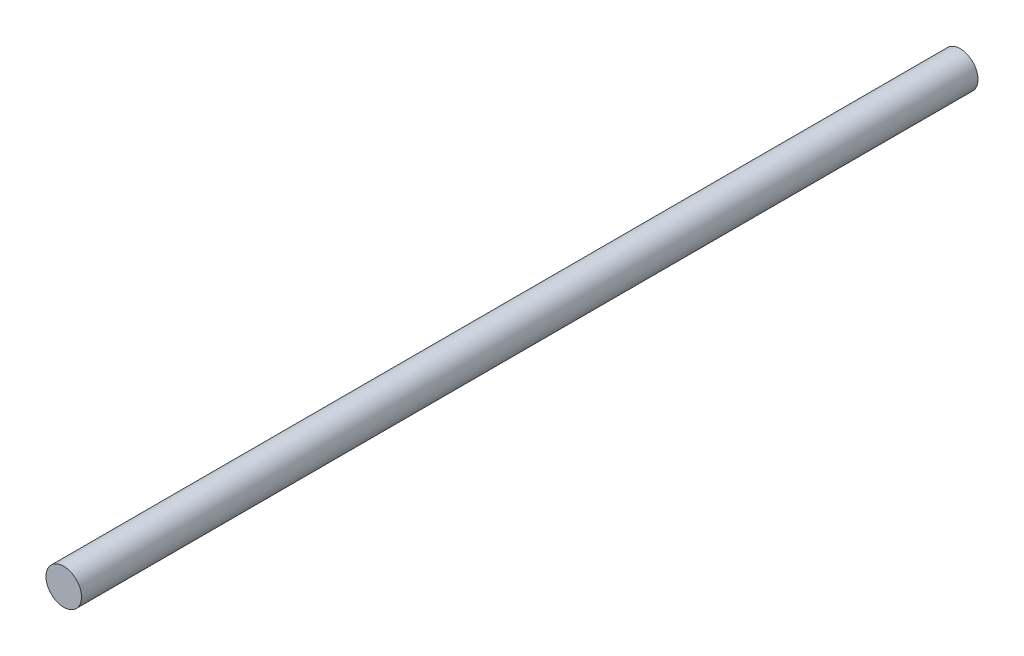
ISO-10303-21;
HEADER;
FILE_DESCRIPTION(('STEP AP214'),'2;1');
FILE_NAME('part.step','',(''),(''),'','','');
FILE_SCHEMA(('AUTOMOTIVE_DESIGN { 1 0 10303 214 1 1 1 1 }'));
ENDSEC;
DATA;
#1=APPLICATION_CONTEXT('core data for automotive mechanical design processes');
#2=APPLICATION_PROTOCOL_DEFINITION('international standard','automotive_design',2000,#1);
#3=PRODUCT_CONTEXT('',#1,'mechanical');
#4=PRODUCT('Part','Part','',(#3));
#5=PRODUCT_RELATED_PRODUCT_CATEGORY('part','',(#4));
#6=PRODUCT_DEFINITION_FORMATION('','',#4);
#7=PRODUCT_DEFINITION_CONTEXT('part definition',#1,'design');
#8=PRODUCT_DEFINITION('design','',#6,#7);
#9=PRODUCT_DEFINITION_SHAPE('','',#8);
#10=(LENGTH_UNIT() NAMED_UNIT(*) SI_UNIT(.MILLI.,.METRE.));
#11=(NAMED_UNIT(*) PLANE_ANGLE_UNIT() SI_UNIT($,.RADIAN.));
#12=(NAMED_UNIT(*) SI_UNIT($,.STERADIAN.) SOLID_ANGLE_UNIT());
#13=UNCERTAINTY_MEASURE_WITH_UNIT(LENGTH_MEASURE(1.E-05),#10,'distance_accuracy_value','');
#14=(GEOMETRIC_REPRESENTATION_CONTEXT(3) GLOBAL_UNCERTAINTY_ASSIGNED_CONTEXT((#13)) GLOBAL_UNIT_ASSIGNED_CONTEXT((#10,
#11,#12)) REPRESENTATION_CONTEXT('',''));
#15=CARTESIAN_POINT('',(0.,0.,0.));
#16=DIRECTION('',(0.,0.,1.));
#17=DIRECTION('',(1.,0.,0.));
#18=AXIS2_PLACEMENT_3D('',#15,#16,#17);
#19=CARTESIAN_POINT('',(0.,0.,151.3));
#20=DIRECTION('',(0.,0.,-1.));
#21=DIRECTION('',(-1.,0.,0.));
#22=AXIS2_PLACEMENT_3D('',#19,#20,#21);
#23=CYLINDRICAL_SURFACE('',#22,3.);
#24=CARTESIAN_POINT('',(0.,0.,151.3));
#25=DIRECTION('',(0.,0.,1.));
#26=DIRECTION('',(1.,0.,0.));
#27=AXIS2_PLACEMENT_3D('',#24,#25,#26);
#28=CIRCLE('',#27,3.);
#29=CARTESIAN_POINT('',(3.,0.,151.3));
#30=VERTEX_POINT('',#29);
#31=EDGE_CURVE('E10',#30,#30,#28,.T.);
#32=ORIENTED_EDGE('',*,*,#31,.F.);
#33=EDGE_LOOP('',(#32));
#34=FACE_BOUND('',#33,.T.);
#35=CARTESIAN_POINT('',(0.,0.,0.));
#36=DIRECTION('',(0.,0.,1.));
#37=DIRECTION('',(1.,0.,0.));
#38=AXIS2_PLACEMENT_3D('',#35,#36,#37);
#39=CIRCLE('',#38,3.);
#40=CARTESIAN_POINT('',(3.,0.,0.));
#41=VERTEX_POINT('',#40);
#42=EDGE_CURVE('E40',#41,#41,#39,.T.);
#43=ORIENTED_EDGE('',*,*,#42,.T.);
#44=EDGE_LOOP('',(#43));
#45=FACE_BOUND('',#44,.T.);
#46=ADVANCED_FACE('F37',(#34,#45),#23,.T.);
#47=CARTESIAN_POINT('',(0.,0.,151.3));
#48=DIRECTION('',(0.,0.,1.));
#49=DIRECTION('',(1.,0.,0.));
#50=AXIS2_PLACEMENT_3D('',#47,#48,#49);
#51=PLANE('',#50);
#52=ORIENTED_EDGE('',*,*,#31,.T.);
#53=EDGE_LOOP('',(#52));
#54=FACE_BOUND('',#53,.T.);
#55=ADVANCED_FACE('F52',(#54),#51,.T.);
#56=CARTESIAN_POINT('',(0.,0.,0.));
#57=DIRECTION('',(0.,0.,1.));
#58=DIRECTION('',(1.,0.,0.));
#59=AXIS2_PLACEMENT_3D('',#56,#57,#58);
#60=PLANE('',#59);
#61=ORIENTED_EDGE('',*,*,#42,.F.);
#62=EDGE_LOOP('',(#61));
#63=FACE_BOUND('',#62,.T.);
#64=ADVANCED_FACE('F50',(#63),#60,.F.);
#65=CLOSED_SHELL('',(#46,#55,#64));
#66=MANIFOLD_SOLID_BREP('B2',#65);
#67=ADVANCED_BREP_SHAPE_REPRESENTATION('',(#18,#66),#14);
#68=SHAPE_DEFINITION_REPRESENTATION(#9,#67);
ENDSEC;
END-ISO-10303-21;
